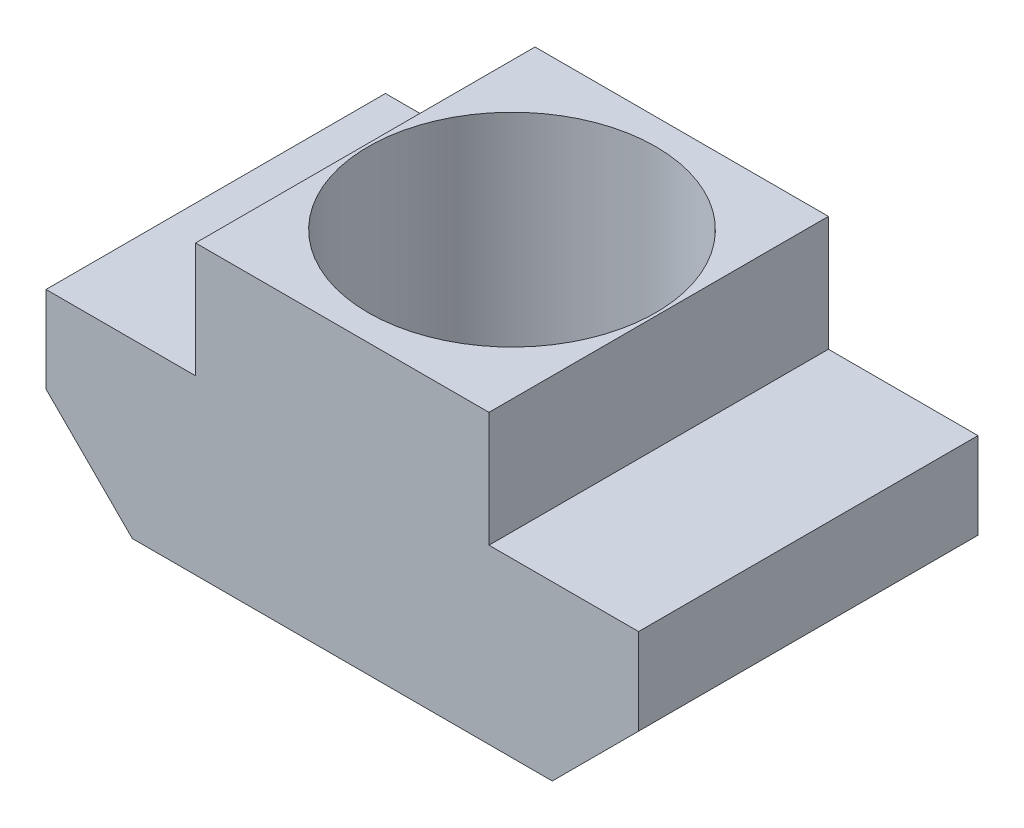
ISO-10303-21;
HEADER;
FILE_DESCRIPTION(('STEP AP214'),'2;1');
FILE_NAME('part.step','',(''),(''),'','','');
FILE_SCHEMA(('AUTOMOTIVE_DESIGN { 1 0 10303 214 1 1 1 1 }'));
ENDSEC;
DATA;
#1=APPLICATION_CONTEXT('core data for automotive mechanical design processes');
#2=APPLICATION_PROTOCOL_DEFINITION('international standard','automotive_design',2000,#1);
#3=PRODUCT_CONTEXT('',#1,'mechanical');
#4=PRODUCT('Part','Part','',(#3));
#5=PRODUCT_RELATED_PRODUCT_CATEGORY('part','',(#4));
#6=PRODUCT_DEFINITION_FORMATION('','',#4);
#7=PRODUCT_DEFINITION_CONTEXT('part definition',#1,'design');
#8=PRODUCT_DEFINITION('design','',#6,#7);
#9=PRODUCT_DEFINITION_SHAPE('','',#8);
#10=(LENGTH_UNIT() NAMED_UNIT(*) SI_UNIT(.MILLI.,.METRE.));
#11=(NAMED_UNIT(*) PLANE_ANGLE_UNIT() SI_UNIT($,.RADIAN.));
#12=(NAMED_UNIT(*) SI_UNIT($,.STERADIAN.) SOLID_ANGLE_UNIT());
#13=UNCERTAINTY_MEASURE_WITH_UNIT(LENGTH_MEASURE(1.E-05),#10,'distance_accuracy_value','');
#14=(GEOMETRIC_REPRESENTATION_CONTEXT(3) GLOBAL_UNCERTAINTY_ASSIGNED_CONTEXT((#13)) GLOBAL_UNIT_ASSIGNED_CONTEXT((#10,
#11,#12)) REPRESENTATION_CONTEXT('',''));
#15=CARTESIAN_POINT('',(0.,0.,0.));
#16=DIRECTION('',(0.,0.,1.));
#17=DIRECTION('',(1.,0.,0.));
#18=AXIS2_PLACEMENT_3D('',#15,#16,#17);
#19=CARTESIAN_POINT('',(0.,3.,-2.95));
#20=DIRECTION('',(0.,0.,1.));
#21=DIRECTION('',(1.,0.,0.));
#22=AXIS2_PLACEMENT_3D('',#19,#20,#21);
#23=PLANE('',#22);
#24=DIRECTION('',(-1.,0.,0.));
#25=VECTOR('',#24,1.);
#26=CARTESIAN_POINT('',(0.,0.,-2.95));
#27=LINE('',#26,#25);
#28=CARTESIAN_POINT('',(3.65000000000004,0.,-2.95));
#29=VERTEX_POINT('',#28);
#30=CARTESIAN_POINT('',(-3.64999999999996,0.,-2.95));
#31=VERTEX_POINT('',#30);
#32=EDGE_CURVE('E132',#29,#31,#27,.T.);
#33=ORIENTED_EDGE('',*,*,#32,.T.);
#34=DIRECTION('',(-0.707106781186557,0.707106781186538,0.));
#35=VECTOR('',#34,1.);
#36=CARTESIAN_POINT('',(-5.15,1.5,-2.95));
#37=LINE('',#36,#35);
#38=CARTESIAN_POINT('',(-5.15,1.5,-2.95));
#39=VERTEX_POINT('',#38);
#40=EDGE_CURVE('E56',#31,#39,#37,.T.);
#41=ORIENTED_EDGE('',*,*,#40,.T.);
#42=DIRECTION('',(0.,-1.,0.));
#43=VECTOR('',#42,1.);
#44=CARTESIAN_POINT('',(-5.15,3.,-2.95));
#45=LINE('',#44,#43);
#46=CARTESIAN_POINT('',(-5.15,3.,-2.95));
#47=VERTEX_POINT('',#46);
#48=EDGE_CURVE('E11',#47,#39,#45,.T.);
#49=ORIENTED_EDGE('',*,*,#48,.F.);
#50=DIRECTION('',(-1.,0.,0.));
#51=VECTOR('',#50,1.);
#52=CARTESIAN_POINT('',(0.,3.,-2.95));
#53=LINE('',#52,#51);
#54=CARTESIAN_POINT('',(-2.55,3.,-2.95));
#55=VERTEX_POINT('',#54);
#56=EDGE_CURVE('E141',#55,#47,#53,.T.);
#57=ORIENTED_EDGE('',*,*,#56,.F.);
#58=DIRECTION('',(0.,-1.,0.));
#59=VECTOR('',#58,1.);
#60=CARTESIAN_POINT('',(-2.55,5.,-2.95));
#61=LINE('',#60,#59);
#62=CARTESIAN_POINT('',(-2.55,5.,-2.95));
#63=VERTEX_POINT('',#62);
#64=EDGE_CURVE('E153',#63,#55,#61,.T.);
#65=ORIENTED_EDGE('',*,*,#64,.F.);
#66=DIRECTION('',(-1.,0.,0.));
#67=VECTOR('',#66,1.);
#68=CARTESIAN_POINT('',(0.,5.,-2.95));
#69=LINE('',#68,#67);
#70=CARTESIAN_POINT('',(2.55,5.,-2.95));
#71=VERTEX_POINT('',#70);
#72=EDGE_CURVE('E200',#71,#63,#69,.T.);
#73=ORIENTED_EDGE('',*,*,#72,.F.);
#74=DIRECTION('',(0.,-1.,0.));
#75=VECTOR('',#74,1.);
#76=CARTESIAN_POINT('',(2.55,5.,-2.95));
#77=LINE('',#76,#75);
#78=CARTESIAN_POINT('',(2.55,3.,-2.95));
#79=VERTEX_POINT('',#78);
#80=EDGE_CURVE('E180',#71,#79,#77,.T.);
#81=ORIENTED_EDGE('',*,*,#80,.T.);
#82=DIRECTION('',(-1.,0.,0.));
#83=VECTOR('',#82,1.);
#84=CARTESIAN_POINT('',(0.,3.,-2.95));
#85=LINE('',#84,#83);
#86=CARTESIAN_POINT('',(5.15,3.,-2.95));
#87=VERTEX_POINT('',#86);
#88=EDGE_CURVE('E124',#87,#79,#85,.T.);
#89=ORIENTED_EDGE('',*,*,#88,.F.);
#90=DIRECTION('',(0.,-1.,0.));
#91=VECTOR('',#90,1.);
#92=CARTESIAN_POINT('',(5.15,3.,-2.95));
#93=LINE('',#92,#91);
#94=CARTESIAN_POINT('',(5.15,1.5,-2.95));
#95=VERTEX_POINT('',#94);
#96=EDGE_CURVE('E210',#87,#95,#93,.T.);
#97=ORIENTED_EDGE('',*,*,#96,.T.);
#98=DIRECTION('',(-0.707106781186538,-0.707106781186557,0.));
#99=VECTOR('',#98,1.);
#100=CARTESIAN_POINT('',(5.15,1.5,-2.95));
#101=LINE('',#100,#99);
#102=EDGE_CURVE('E64',#95,#29,#101,.T.);
#103=ORIENTED_EDGE('',*,*,#102,.T.);
#104=EDGE_LOOP('',(#33,#41,#49,#57,#65,#73,#81,#89,#97,#103));
#105=FACE_BOUND('',#104,.T.);
#106=ADVANCED_FACE('F41',(#105),#23,.F.);
#107=CARTESIAN_POINT('',(-5.15,3.,0.));
#108=DIRECTION('',(1.,0.,0.));
#109=DIRECTION('',(0.,0.,-1.));
#110=AXIS2_PLACEMENT_3D('',#107,#108,#109);
#111=PLANE('',#110);
#112=ORIENTED_EDGE('',*,*,#48,.T.);
#113=DIRECTION('',(0.,0.,1.));
#114=VECTOR('',#113,1.);
#115=CARTESIAN_POINT('',(-5.15,1.5,-2.95));
#116=LINE('',#115,#114);
#117=CARTESIAN_POINT('',(-5.15,1.5,2.95));
#118=VERTEX_POINT('',#117);
#119=EDGE_CURVE('E116',#39,#118,#116,.T.);
#120=ORIENTED_EDGE('',*,*,#119,.T.);
#121=DIRECTION('',(0.,-1.,0.));
#122=VECTOR('',#121,1.);
#123=CARTESIAN_POINT('',(-5.15,3.,2.95));
#124=LINE('',#123,#122);
#125=CARTESIAN_POINT('',(-5.15,3.,2.95));
#126=VERTEX_POINT('',#125);
#127=EDGE_CURVE('E49',#126,#118,#124,.T.);
#128=ORIENTED_EDGE('',*,*,#127,.F.);
#129=DIRECTION('',(0.,0.,1.));
#130=VECTOR('',#129,1.);
#131=CARTESIAN_POINT('',(-5.15,3.,0.));
#132=LINE('',#131,#130);
#133=EDGE_CURVE('E136',#47,#126,#132,.T.);
#134=ORIENTED_EDGE('',*,*,#133,.F.);
#135=EDGE_LOOP('',(#112,#120,#128,#134));
#136=FACE_BOUND('',#135,.T.);
#137=ADVANCED_FACE('F135',(#136),#111,.F.);
#138=CARTESIAN_POINT('',(0.,3.,2.95));
#139=DIRECTION('',(0.,0.,1.));
#140=DIRECTION('',(1.,0.,0.));
#141=AXIS2_PLACEMENT_3D('',#138,#139,#140);
#142=PLANE('',#141);
#143=DIRECTION('',(-0.707106781186557,0.707106781186538,0.));
#144=VECTOR('',#143,1.);
#145=CARTESIAN_POINT('',(-5.15,1.5,2.95));
#146=LINE('',#145,#144);
#147=CARTESIAN_POINT('',(-3.64999999999996,0.,2.95));
#148=VERTEX_POINT('',#147);
#149=EDGE_CURVE('E119',#148,#118,#146,.T.);
#150=ORIENTED_EDGE('',*,*,#149,.F.);
#151=DIRECTION('',(-1.,0.,0.));
#152=VECTOR('',#151,1.);
#153=CARTESIAN_POINT('',(0.,0.,2.95));
#154=LINE('',#153,#152);
#155=CARTESIAN_POINT('',(3.65000000000004,0.,2.95));
#156=VERTEX_POINT('',#155);
#157=EDGE_CURVE('E152',#156,#148,#154,.T.);
#158=ORIENTED_EDGE('',*,*,#157,.F.);
#159=DIRECTION('',(-0.707106781186538,-0.707106781186557,0.));
#160=VECTOR('',#159,1.);
#161=CARTESIAN_POINT('',(5.15,1.5,2.95));
#162=LINE('',#161,#160);
#163=CARTESIAN_POINT('',(5.15,1.5,2.95));
#164=VERTEX_POINT('',#163);
#165=EDGE_CURVE('E236',#164,#156,#162,.T.);
#166=ORIENTED_EDGE('',*,*,#165,.F.);
#167=DIRECTION('',(0.,-1.,0.));
#168=VECTOR('',#167,1.);
#169=CARTESIAN_POINT('',(5.15,3.,2.95));
#170=LINE('',#169,#168);
#171=CARTESIAN_POINT('',(5.15,3.,2.95));
#172=VERTEX_POINT('',#171);
#173=EDGE_CURVE('E190',#172,#164,#170,.T.);
#174=ORIENTED_EDGE('',*,*,#173,.F.);
#175=DIRECTION('',(-1.,0.,0.));
#176=VECTOR('',#175,1.);
#177=CARTESIAN_POINT('',(0.,3.,2.95));
#178=LINE('',#177,#176);
#179=CARTESIAN_POINT('',(2.55,3.,2.95));
#180=VERTEX_POINT('',#179);
#181=EDGE_CURVE('E218',#172,#180,#178,.T.);
#182=ORIENTED_EDGE('',*,*,#181,.T.);
#183=DIRECTION('',(0.,-1.,0.));
#184=VECTOR('',#183,1.);
#185=CARTESIAN_POINT('',(2.55,5.,2.95));
#186=LINE('',#185,#184);
#187=CARTESIAN_POINT('',(2.55,5.,2.95));
#188=VERTEX_POINT('',#187);
#189=EDGE_CURVE('E177',#188,#180,#186,.T.);
#190=ORIENTED_EDGE('',*,*,#189,.F.);
#191=DIRECTION('',(-1.,0.,0.));
#192=VECTOR('',#191,1.);
#193=CARTESIAN_POINT('',(0.,5.,2.95));
#194=LINE('',#193,#192);
#195=CARTESIAN_POINT('',(-2.55,5.,2.95));
#196=VERTEX_POINT('',#195);
#197=EDGE_CURVE('E194',#188,#196,#194,.T.);
#198=ORIENTED_EDGE('',*,*,#197,.T.);
#199=DIRECTION('',(0.,-1.,0.));
#200=VECTOR('',#199,1.);
#201=CARTESIAN_POINT('',(-2.55,5.,2.95));
#202=LINE('',#201,#200);
#203=CARTESIAN_POINT('',(-2.55,3.,2.95));
#204=VERTEX_POINT('',#203);
#205=EDGE_CURVE('E163',#196,#204,#202,.T.);
#206=ORIENTED_EDGE('',*,*,#205,.T.);
#207=DIRECTION('',(-1.,0.,0.));
#208=VECTOR('',#207,1.);
#209=CARTESIAN_POINT('',(0.,3.,2.95));
#210=LINE('',#209,#208);
#211=EDGE_CURVE('E140',#204,#126,#210,.T.);
#212=ORIENTED_EDGE('',*,*,#211,.T.);
#213=ORIENTED_EDGE('',*,*,#127,.T.);
#214=EDGE_LOOP('',(#150,#158,#166,#174,#182,#190,#198,#206,#212,#213));
#215=FACE_BOUND('',#214,.T.);
#216=ADVANCED_FACE('F158',(#215),#142,.T.);
#217=CARTESIAN_POINT('',(0.,3.,0.));
#218=DIRECTION('',(0.,1.,0.));
#219=DIRECTION('',(0.,0.,1.));
#220=AXIS2_PLACEMENT_3D('',#217,#218,#219);
#221=PLANE('',#220);
#222=DIRECTION('',(0.,0.,1.));
#223=VECTOR('',#222,1.);
#224=CARTESIAN_POINT('',(-2.55,3.,0.));
#225=LINE('',#224,#223);
#226=EDGE_CURVE('E146',#55,#204,#225,.T.);
#227=ORIENTED_EDGE('',*,*,#226,.F.);
#228=ORIENTED_EDGE('',*,*,#56,.T.);
#229=ORIENTED_EDGE('',*,*,#133,.T.);
#230=ORIENTED_EDGE('',*,*,#211,.F.);
#231=EDGE_LOOP('',(#227,#228,#229,#230));
#232=FACE_BOUND('',#231,.T.);
#233=ADVANCED_FACE('F166',(#232),#221,.T.);
#234=CARTESIAN_POINT('',(0.,0.,0.));
#235=DIRECTION('',(0.,1.,0.));
#236=DIRECTION('',(0.,0.,1.));
#237=AXIS2_PLACEMENT_3D('',#234,#235,#236);
#238=PLANE('',#237);
#239=ORIENTED_EDGE('',*,*,#157,.T.);
#240=DIRECTION('',(0.,0.,1.));
#241=VECTOR('',#240,1.);
#242=CARTESIAN_POINT('',(-3.64999999999996,0.,-2.95));
#243=LINE('',#242,#241);
#244=EDGE_CURVE('E125',#31,#148,#243,.T.);
#245=ORIENTED_EDGE('',*,*,#244,.F.);
#246=ORIENTED_EDGE('',*,*,#32,.F.);
#247=DIRECTION('',(0.,0.,1.));
#248=VECTOR('',#247,1.);
#249=CARTESIAN_POINT('',(3.65000000000004,0.,-2.95));
#250=LINE('',#249,#248);
#251=EDGE_CURVE('E232',#29,#156,#250,.T.);
#252=ORIENTED_EDGE('',*,*,#251,.T.);
#253=EDGE_LOOP('',(#239,#245,#246,#252));
#254=FACE_BOUND('',#253,.T.);
#255=CARTESIAN_POINT('',(0.,0.,0.));
#256=DIRECTION('',(0.,1.,0.));
#257=DIRECTION('',(0.,0.,1.));
#258=AXIS2_PLACEMENT_3D('',#255,#256,#257);
#259=CIRCLE('',#258,2.5);
#260=CARTESIAN_POINT('',(0.,0.,2.5));
#261=VERTEX_POINT('',#260);
#262=EDGE_CURVE('E185',#261,#261,#259,.T.);
#263=ORIENTED_EDGE('',*,*,#262,.T.);
#264=EDGE_LOOP('',(#263));
#265=FACE_BOUND('',#264,.T.);
#266=ADVANCED_FACE('F245',(#254,#265),#238,.F.);
#267=CARTESIAN_POINT('',(-2.55,5.,0.));
#268=DIRECTION('',(1.,0.,0.));
#269=DIRECTION('',(0.,0.,-1.));
#270=AXIS2_PLACEMENT_3D('',#267,#268,#269);
#271=PLANE('',#270);
#272=ORIENTED_EDGE('',*,*,#64,.T.);
#273=ORIENTED_EDGE('',*,*,#226,.T.);
#274=ORIENTED_EDGE('',*,*,#205,.F.);
#275=DIRECTION('',(0.,0.,1.));
#276=VECTOR('',#275,1.);
#277=CARTESIAN_POINT('',(-2.55,5.,0.));
#278=LINE('',#277,#276);
#279=EDGE_CURVE('E197',#63,#196,#278,.T.);
#280=ORIENTED_EDGE('',*,*,#279,.F.);
#281=EDGE_LOOP('',(#272,#273,#274,#280));
#282=FACE_BOUND('',#281,.T.);
#283=ADVANCED_FACE('F169',(#282),#271,.F.);
#284=CARTESIAN_POINT('',(0.,5.,0.));
#285=DIRECTION('',(0.,-1.,0.));
#286=DIRECTION('',(0.,0.,-1.));
#287=AXIS2_PLACEMENT_3D('',#284,#285,#286);
#288=CYLINDRICAL_SURFACE('',#287,2.5);
#289=CARTESIAN_POINT('',(0.,5.,0.));
#290=DIRECTION('',(0.,1.,0.));
#291=DIRECTION('',(0.,0.,1.));
#292=AXIS2_PLACEMENT_3D('',#289,#290,#291);
#293=CIRCLE('',#292,2.5);
#294=CARTESIAN_POINT('',(0.,5.,2.5));
#295=VERTEX_POINT('',#294);
#296=EDGE_CURVE('E189',#295,#295,#293,.T.);
#297=ORIENTED_EDGE('',*,*,#296,.T.);
#298=EDGE_LOOP('',(#297));
#299=FACE_BOUND('',#298,.T.);
#300=ORIENTED_EDGE('',*,*,#262,.F.);
#301=EDGE_LOOP('',(#300));
#302=FACE_BOUND('',#301,.T.);
#303=ADVANCED_FACE('F263',(#299,#302),#288,.F.);
#304=CARTESIAN_POINT('',(2.55,5.,0.));
#305=DIRECTION('',(1.,0.,0.));
#306=DIRECTION('',(0.,0.,-1.));
#307=AXIS2_PLACEMENT_3D('',#304,#305,#306);
#308=PLANE('',#307);
#309=DIRECTION('',(0.,0.,1.));
#310=VECTOR('',#309,1.);
#311=CARTESIAN_POINT('',(2.55,3.,0.));
#312=LINE('',#311,#310);
#313=EDGE_CURVE('E222',#79,#180,#312,.T.);
#314=ORIENTED_EDGE('',*,*,#313,.F.);
#315=ORIENTED_EDGE('',*,*,#80,.F.);
#316=DIRECTION('',(0.,0.,1.));
#317=VECTOR('',#316,1.);
#318=CARTESIAN_POINT('',(2.55,5.,0.));
#319=LINE('',#318,#317);
#320=EDGE_CURVE('E184',#71,#188,#319,.T.);
#321=ORIENTED_EDGE('',*,*,#320,.T.);
#322=ORIENTED_EDGE('',*,*,#189,.T.);
#323=EDGE_LOOP('',(#314,#315,#321,#322));
#324=FACE_BOUND('',#323,.T.);
#325=ADVANCED_FACE('F260',(#324),#308,.T.);
#326=CARTESIAN_POINT('',(0.,5.,0.));
#327=DIRECTION('',(0.,1.,0.));
#328=DIRECTION('',(0.,0.,1.));
#329=AXIS2_PLACEMENT_3D('',#326,#327,#328);
#330=PLANE('',#329);
#331=ORIENTED_EDGE('',*,*,#296,.F.);
#332=EDGE_LOOP('',(#331));
#333=FACE_BOUND('',#332,.T.);
#334=ORIENTED_EDGE('',*,*,#72,.T.);
#335=ORIENTED_EDGE('',*,*,#279,.T.);
#336=ORIENTED_EDGE('',*,*,#197,.F.);
#337=ORIENTED_EDGE('',*,*,#320,.F.);
#338=EDGE_LOOP('',(#334,#335,#336,#337));
#339=FACE_BOUND('',#338,.T.);
#340=ADVANCED_FACE('F259',(#333,#339),#330,.T.);
#341=CARTESIAN_POINT('',(5.15,3.,0.));
#342=DIRECTION('',(1.,0.,0.));
#343=DIRECTION('',(0.,0.,-1.));
#344=AXIS2_PLACEMENT_3D('',#341,#342,#343);
#345=PLANE('',#344);
#346=DIRECTION('',(0.,0.,1.));
#347=VECTOR('',#346,1.);
#348=CARTESIAN_POINT('',(5.15,1.5,-2.95));
#349=LINE('',#348,#347);
#350=EDGE_CURVE('E229',#95,#164,#349,.T.);
#351=ORIENTED_EDGE('',*,*,#350,.F.);
#352=ORIENTED_EDGE('',*,*,#96,.F.);
#353=DIRECTION('',(0.,0.,1.));
#354=VECTOR('',#353,1.);
#355=CARTESIAN_POINT('',(5.15,3.,0.));
#356=LINE('',#355,#354);
#357=EDGE_CURVE('E214',#87,#172,#356,.T.);
#358=ORIENTED_EDGE('',*,*,#357,.T.);
#359=ORIENTED_EDGE('',*,*,#173,.T.);
#360=EDGE_LOOP('',(#351,#352,#358,#359));
#361=FACE_BOUND('',#360,.T.);
#362=ADVANCED_FACE('F250',(#361),#345,.T.);
#363=CARTESIAN_POINT('',(0.,3.,0.));
#364=DIRECTION('',(0.,1.,0.));
#365=DIRECTION('',(0.,0.,1.));
#366=AXIS2_PLACEMENT_3D('',#363,#364,#365);
#367=PLANE('',#366);
#368=ORIENTED_EDGE('',*,*,#88,.T.);
#369=ORIENTED_EDGE('',*,*,#313,.T.);
#370=ORIENTED_EDGE('',*,*,#181,.F.);
#371=ORIENTED_EDGE('',*,*,#357,.F.);
#372=EDGE_LOOP('',(#368,#369,#370,#371));
#373=FACE_BOUND('',#372,.T.);
#374=ADVANCED_FACE('F254',(#373),#367,.T.);
#375=CARTESIAN_POINT('',(5.15,1.5,-2.95));
#376=DIRECTION('',(-0.707106781186558,0.707106781186538,0.));
#377=DIRECTION('',(-0.707106781186538,-0.707106781186558,0.));
#378=AXIS2_PLACEMENT_3D('',#375,#376,#377);
#379=PLANE('',#378);
#380=ORIENTED_EDGE('',*,*,#165,.T.);
#381=ORIENTED_EDGE('',*,*,#251,.F.);
#382=ORIENTED_EDGE('',*,*,#102,.F.);
#383=ORIENTED_EDGE('',*,*,#350,.T.);
#384=EDGE_LOOP('',(#380,#381,#382,#383));
#385=FACE_BOUND('',#384,.T.);
#386=ADVANCED_FACE('F316',(#385),#379,.F.);
#387=CARTESIAN_POINT('',(-5.15,1.5,-2.95));
#388=DIRECTION('',(0.707106781186538,0.707106781186557,0.));
#389=DIRECTION('',(-0.707106781186557,0.707106781186538,0.));
#390=AXIS2_PLACEMENT_3D('',#387,#388,#389);
#391=PLANE('',#390);
#392=ORIENTED_EDGE('',*,*,#149,.T.);
#393=ORIENTED_EDGE('',*,*,#119,.F.);
#394=ORIENTED_EDGE('',*,*,#40,.F.);
#395=ORIENTED_EDGE('',*,*,#244,.T.);
#396=EDGE_LOOP('',(#392,#393,#394,#395));
#397=FACE_BOUND('',#396,.T.);
#398=ADVANCED_FACE('F117',(#397),#391,.F.);
#399=CLOSED_SHELL('',(#106,#137,#216,#233,#266,#283,#303,#325,#340,#362,#374,#386,#398));
#400=MANIFOLD_SOLID_BREP('B2',#399);
#401=ADVANCED_BREP_SHAPE_REPRESENTATION('',(#18,#400),#14);
#402=SHAPE_DEFINITION_REPRESENTATION(#9,#401);
ENDSEC;
END-ISO-10303-21;
